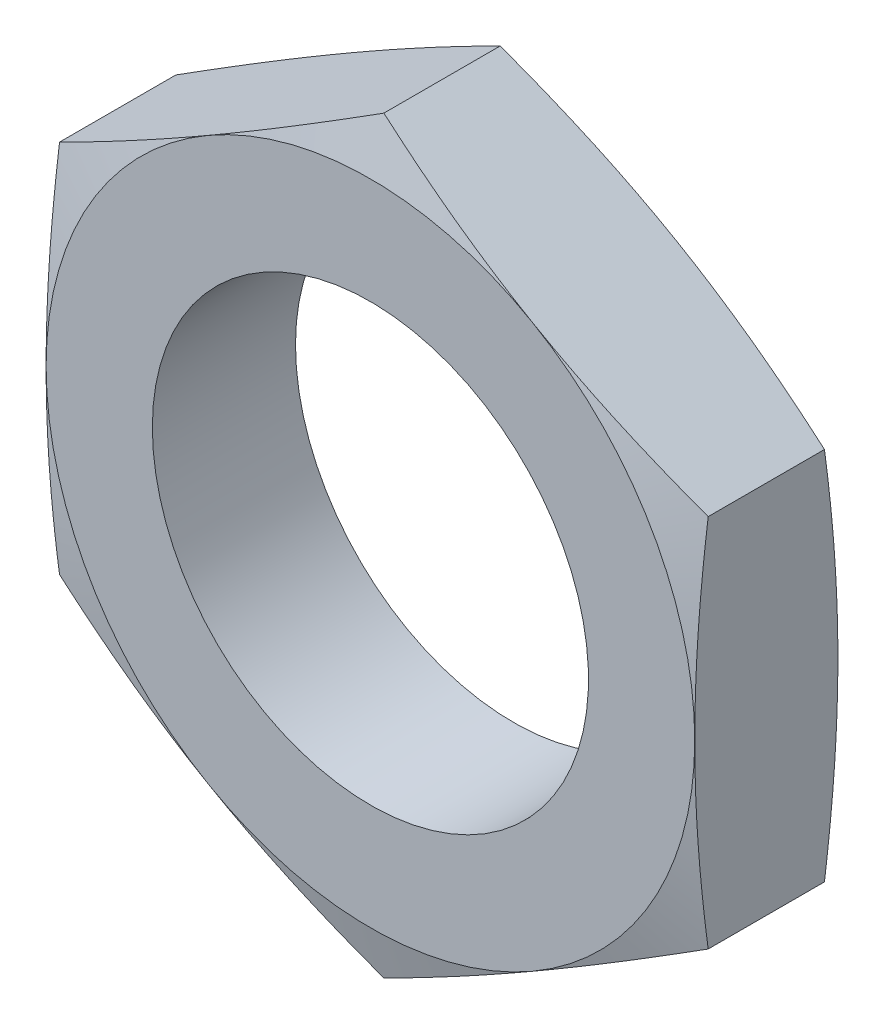
ISO-10303-21;
HEADER;
FILE_DESCRIPTION(('STEP AP214'),'2;1');
FILE_NAME('part.step','',(''),(''),'','','');
FILE_SCHEMA(('AUTOMOTIVE_DESIGN { 1 0 10303 214 1 1 1 1 }'));
ENDSEC;
DATA;
#1=APPLICATION_CONTEXT('core data for automotive mechanical design processes');
#2=APPLICATION_PROTOCOL_DEFINITION('international standard','automotive_design',2000,#1);
#3=PRODUCT_CONTEXT('',#1,'mechanical');
#4=PRODUCT('Part','Part','',(#3));
#5=PRODUCT_RELATED_PRODUCT_CATEGORY('part','',(#4));
#6=PRODUCT_DEFINITION_FORMATION('','',#4);
#7=PRODUCT_DEFINITION_CONTEXT('part definition',#1,'design');
#8=PRODUCT_DEFINITION('design','',#6,#7);
#9=PRODUCT_DEFINITION_SHAPE('','',#8);
#10=(LENGTH_UNIT() NAMED_UNIT(*) SI_UNIT(.MILLI.,.METRE.));
#11=(NAMED_UNIT(*) PLANE_ANGLE_UNIT() SI_UNIT($,.RADIAN.));
#12=(NAMED_UNIT(*) SI_UNIT($,.STERADIAN.) SOLID_ANGLE_UNIT());
#13=UNCERTAINTY_MEASURE_WITH_UNIT(LENGTH_MEASURE(1.E-05),#10,'distance_accuracy_value','');
#14=(GEOMETRIC_REPRESENTATION_CONTEXT(3) GLOBAL_UNCERTAINTY_ASSIGNED_CONTEXT((#13)) GLOBAL_UNIT_ASSIGNED_CONTEXT((#10,
#11,#12)) REPRESENTATION_CONTEXT('',''));
#15=CARTESIAN_POINT('',(0.,0.,0.));
#16=DIRECTION('',(0.,0.,1.));
#17=DIRECTION('',(1.,0.,0.));
#18=AXIS2_PLACEMENT_3D('',#15,#16,#17);
#19=CARTESIAN_POINT('',(14.4999999999999,8.37157890324973,6.4));
#20=DIRECTION('',(-0.499999999999995,-0.866025403784442,0.));
#21=DIRECTION('',(0.866025403784442,-0.499999999999995,0.));
#22=AXIS2_PLACEMENT_3D('',#19,#20,#21);
#23=PLANE('',#22);
#24=CARTESIAN_POINT('',(-0.000199999999999569,16.743273276553,0.601083263174753));
#25=CARTESIAN_POINT('',(0.601965186280981,16.395613044157,0.507890804699053));
#26=CARTESIAN_POINT('',(1.20522213258625,16.0473224838172,0.423287577643832));
#27=CARTESIAN_POINT('',(2.41386637390098,15.3495114057396,0.274647818411473));
#28=CARTESIAN_POINT('',(3.01925443351179,14.9999904465591,0.210619639168989));
#29=CARTESIAN_POINT('',(4.22849061008879,14.3018376144986,0.106867737742874));
#30=CARTESIAN_POINT('',(4.83233055103587,13.9532104620453,0.0670202927629115));
#31=CARTESIAN_POINT('',(6.04078044240142,13.2555115919633,0.0135889643184655));
#32=CARTESIAN_POINT('',(6.64539022120068,12.9064399734189,0.));
#33=CARTESIAN_POINT('',(7.8546097787992,12.20829673633,0.));
#34=CARTESIAN_POINT('',(8.45921955759846,11.8592251177856,0.0135889643184655));
#35=CARTESIAN_POINT('',(9.66766944896401,11.1615262477035,0.0670202927629114));
#36=CARTESIAN_POINT('',(10.2715093899111,10.8128990952503,0.106867737742873));
#37=CARTESIAN_POINT('',(11.4807455664881,10.1147462631897,0.210619639168988));
#38=CARTESIAN_POINT('',(12.0861336260989,9.76522530400923,0.274647818411473));
#39=CARTESIAN_POINT('',(13.2947778674136,9.06741422593169,0.423287577643832));
#40=CARTESIAN_POINT('',(13.8980348137189,8.71912366559184,0.507890804699053));
#41=CARTESIAN_POINT('',(14.5001999999999,8.37146343319589,0.601083263174753));
#42=B_SPLINE_CURVE_WITH_KNOTS('',3,(#24,#25,#26,#27,#28,#29,#30,#31,#32,#33,#34,#35,#36,#37,#38,
#39,#40,#41),.UNSPECIFIED.,.F.,.F.,(4,2,2,2,2,2,2,2,4),(0.,2.10472386863188,4.21030112410751,
6.30501212383057,8.39931776929981,10.493623414769,12.5883344144921,14.6939116699677,
16.7986355385996),.UNSPECIFIED.);
#43=CARTESIAN_POINT('',(0.,16.7431578064991,0.601052322747009));
#44=VERTEX_POINT('',#43);
#45=CARTESIAN_POINT('',(7.24999999999991,12.5573683548744,0.));
#46=VERTEX_POINT('',#45);
#47=EDGE_CURVE('E55',#44,#46,#42,.T.);
#48=ORIENTED_EDGE('',*,*,#47,.F.);
#49=DIRECTION('',(0.,0.,-1.));
#50=VECTOR('',#49,1.);
#51=CARTESIAN_POINT('',(0.,16.7431578064991,6.4));
#52=LINE('',#51,#50);
#53=CARTESIAN_POINT('',(0.,16.7431578064991,5.79894767725301));
#54=VERTEX_POINT('',#53);
#55=EDGE_CURVE('E172',#54,#44,#52,.T.);
#56=ORIENTED_EDGE('',*,*,#55,.F.);
#57=CARTESIAN_POINT('',(14.5001999999999,8.37146343319589,5.79891673682526));
#58=CARTESIAN_POINT('',(13.8980348137189,8.71912366559183,5.89210919530096));
#59=CARTESIAN_POINT('',(13.2947778674136,9.06741422593169,5.97671242235618));
#60=CARTESIAN_POINT('',(12.0861336260989,9.76522530400922,6.12535218158854));
#61=CARTESIAN_POINT('',(11.4807455664881,10.1147462631897,6.18938036083103));
#62=CARTESIAN_POINT('',(10.2715093899111,10.8128990952503,6.29313226225714));
#63=CARTESIAN_POINT('',(9.66766944896402,11.1615262477035,6.3329797072371));
#64=CARTESIAN_POINT('',(8.45921955759846,11.8592251177856,6.38641103568155));
#65=CARTESIAN_POINT('',(7.8546097787992,12.20829673633,6.4));
#66=CARTESIAN_POINT('',(6.64539022120068,12.9064399734189,6.4));
#67=CARTESIAN_POINT('',(6.04078044240142,13.2555115919633,6.38641103568155));
#68=CARTESIAN_POINT('',(4.83233055103587,13.9532104620453,6.3329797072371));
#69=CARTESIAN_POINT('',(4.22849061008879,14.3018376144986,6.29313226225714));
#70=CARTESIAN_POINT('',(3.01925443351179,14.9999904465591,6.18938036083103));
#71=CARTESIAN_POINT('',(2.41386637390098,15.3495114057396,6.12535218158854));
#72=CARTESIAN_POINT('',(1.20522213258625,16.0473224838172,5.97671242235618));
#73=CARTESIAN_POINT('',(0.601965186280984,16.395613044157,5.89210919530096));
#74=CARTESIAN_POINT('',(-0.000199999999997783,16.743273276553,5.79891673682526));
#75=B_SPLINE_CURVE_WITH_KNOTS('',3,(#57,#58,#59,#60,#61,#62,#63,#64,#65,#66,#67,#68,#69,#70,#71,
#72,#73,#74),.UNSPECIFIED.,.F.,.F.,(4,2,2,2,2,2,2,2,4),(0.,2.10472386863187,4.21030112410751,
6.30501212383057,8.39931776929981,10.493623414769,12.5883344144921,14.6939116699677,
16.7986355385996),.UNSPECIFIED.);
#76=CARTESIAN_POINT('',(7.24999999999994,12.5573683548744,6.4));
#77=VERTEX_POINT('',#76);
#78=EDGE_CURVE('E245',#77,#54,#75,.T.);
#79=ORIENTED_EDGE('',*,*,#78,.F.);
#80=CARTESIAN_POINT('',(14.4999999999999,8.37157890324973,5.79894767725301));
#81=VERTEX_POINT('',#80);
#82=EDGE_CURVE('E163',#81,#77,#75,.T.);
#83=ORIENTED_EDGE('',*,*,#82,.F.);
#84=DIRECTION('',(0.,0.,-1.));
#85=VECTOR('',#84,1.);
#86=CARTESIAN_POINT('',(14.4999999999999,8.37157890324973,6.4));
#87=LINE('',#86,#85);
#88=CARTESIAN_POINT('',(14.4999999999999,8.37157890324973,0.601052322747009));
#89=VERTEX_POINT('',#88);
#90=EDGE_CURVE('E158',#81,#89,#87,.T.);
#91=ORIENTED_EDGE('',*,*,#90,.T.);
#92=EDGE_CURVE('E150',#46,#89,#42,.T.);
#93=ORIENTED_EDGE('',*,*,#92,.F.);
#94=EDGE_LOOP('',(#48,#56,#79,#83,#91,#93));
#95=FACE_BOUND('',#94,.T.);
#96=ADVANCED_FACE('F39',(#95),#23,.F.);
#97=CARTESIAN_POINT('',(0.,16.7431578064991,6.4));
#98=DIRECTION('',(0.500000000000001,-0.866025403784438,0.));
#99=DIRECTION('',(0.866025403784438,0.500000000000001,0.));
#100=AXIS2_PLACEMENT_3D('',#97,#98,#99);
#101=PLANE('',#100);
#102=CARTESIAN_POINT('',(-14.5002,8.37146343319569,0.601083263174754));
#103=CARTESIAN_POINT('',(-13.898034813719,8.71912366559164,0.507890804699052));
#104=CARTESIAN_POINT('',(-13.2947778674137,9.0674142259315,0.423287577643828));
#105=CARTESIAN_POINT('',(-12.086133626099,9.76522530400906,0.274647818411465));
#106=CARTESIAN_POINT('',(-11.4807455664882,10.1147462631895,0.210619639168979));
#107=CARTESIAN_POINT('',(-10.2715093899112,10.8128990952501,0.106867737742861));
#108=CARTESIAN_POINT('',(-9.6676694489641,11.1615262477034,0.0670202927628979));
#109=CARTESIAN_POINT('',(-8.45921955759853,11.8592251177855,0.0135889643184504));
#110=CARTESIAN_POINT('',(-7.85460977879927,12.2082967363299,0.));
#111=CARTESIAN_POINT('',(-6.64539022120074,12.9064399734188,0.));
#112=CARTESIAN_POINT('',(-6.04078044240147,13.2555115919632,0.0135889643184496));
#113=CARTESIAN_POINT('',(-4.83233055103591,13.9532104620453,0.0670202927628971));
#114=CARTESIAN_POINT('',(-4.22849061008883,14.3018376144985,0.10686773774286));
#115=CARTESIAN_POINT('',(-3.01925443351182,14.9999904465591,0.210619639168978));
#116=CARTESIAN_POINT('',(-2.413866373901,15.3495114057396,0.274647818411464));
#117=CARTESIAN_POINT('',(-1.20522213258626,16.0473224838171,0.423287577643827));
#118=CARTESIAN_POINT('',(-0.601965186280988,16.395613044157,0.50789080469905));
#119=CARTESIAN_POINT('',(0.000199999999997846,16.743273276553,0.601083263174753));
#120=B_SPLINE_CURVE_WITH_KNOTS('',3,(#102,#103,#104,#105,#106,#107,#108,#109,#110,#111,#112,
#113,#114,#115,#116,#117,#118,#119),.UNSPECIFIED.,.F.,.F.,(4,2,2,2,2,2,2,2,4),(0.,
2.1047238686319,4.21030112410756,6.30501212383065,8.39931776929991,10.4936234147692,
12.5883344144923,14.6939116699679,16.7986355385998),.UNSPECIFIED.);
#121=CARTESIAN_POINT('',(-14.5,8.37157890324953,0.601052322747009));
#122=VERTEX_POINT('',#121);
#123=CARTESIAN_POINT('',(-7.25,12.5573683548743,0.));
#124=VERTEX_POINT('',#123);
#125=EDGE_CURVE('E62',#122,#124,#120,.T.);
#126=ORIENTED_EDGE('',*,*,#125,.F.);
#127=DIRECTION('',(0.,0.,-1.));
#128=VECTOR('',#127,1.);
#129=CARTESIAN_POINT('',(-14.5,8.37157890324953,6.4));
#130=LINE('',#129,#128);
#131=CARTESIAN_POINT('',(-14.5,8.37157890324953,5.79894767725301));
#132=VERTEX_POINT('',#131);
#133=EDGE_CURVE('E169',#132,#122,#130,.T.);
#134=ORIENTED_EDGE('',*,*,#133,.F.);
#135=CARTESIAN_POINT('',(0.000200000000000019,16.743273276553,5.79891673682526));
#136=CARTESIAN_POINT('',(-0.601965186280988,16.395613044157,5.89210919530096));
#137=CARTESIAN_POINT('',(-1.20522213258626,16.0473224838171,5.97671242235619));
#138=CARTESIAN_POINT('',(-2.413866373901,15.3495114057396,6.12535218158855));
#139=CARTESIAN_POINT('',(-3.01925443351181,14.9999904465591,6.18938036083104));
#140=CARTESIAN_POINT('',(-4.22849061008882,14.3018376144985,6.29313226225715));
#141=CARTESIAN_POINT('',(-4.8323305510359,13.9532104620453,6.33297970723712));
#142=CARTESIAN_POINT('',(-6.04078044240147,13.2555115919632,6.38641103568157));
#143=CARTESIAN_POINT('',(-6.64539022120073,12.9064399734188,6.40000000000002));
#144=CARTESIAN_POINT('',(-7.85460977879926,12.2082967363299,6.40000000000002));
#145=CARTESIAN_POINT('',(-8.45921955759853,11.8592251177855,6.38641103568157));
#146=CARTESIAN_POINT('',(-9.66766944896409,11.1615262477034,6.33297970723712));
#147=CARTESIAN_POINT('',(-10.2715093899112,10.8128990952501,6.29313226225715));
#148=CARTESIAN_POINT('',(-11.4807455664882,10.1147462631896,6.18938036083104));
#149=CARTESIAN_POINT('',(-12.086133626099,9.76522530400906,6.12535218158855));
#150=CARTESIAN_POINT('',(-13.2947778674137,9.06741422593151,5.97671242235619));
#151=CARTESIAN_POINT('',(-13.898034813719,8.71912366559164,5.89210919530096));
#152=CARTESIAN_POINT('',(-14.5002,8.37146343319569,5.79891673682526));
#153=B_SPLINE_CURVE_WITH_KNOTS('',3,(#135,#136,#137,#138,#139,#140,#141,#142,#143,#144,#145,
#146,#147,#148,#149,#150,#151,#152),.UNSPECIFIED.,.F.,.F.,(4,2,2,2,2,2,2,2,4),(0.,
2.1047238686319,4.21030112410756,6.30501212383065,8.39931776929991,10.4936234147692,
12.5883344144923,14.6939116699679,16.7986355385998),.UNSPECIFIED.);
#154=CARTESIAN_POINT('',(-7.25000000000003,12.5573683548744,6.4));
#155=VERTEX_POINT('',#154);
#156=EDGE_CURVE('E307',#155,#132,#153,.T.);
#157=ORIENTED_EDGE('',*,*,#156,.F.);
#158=EDGE_CURVE('E312',#54,#155,#153,.T.);
#159=ORIENTED_EDGE('',*,*,#158,.F.);
#160=ORIENTED_EDGE('',*,*,#55,.T.);
#161=EDGE_CURVE('E289',#124,#44,#120,.T.);
#162=ORIENTED_EDGE('',*,*,#161,.F.);
#163=EDGE_LOOP('',(#126,#134,#157,#159,#160,#162));
#164=FACE_BOUND('',#163,.T.);
#165=ADVANCED_FACE('F300',(#164),#101,.F.);
#166=CARTESIAN_POINT('',(-14.5,8.37157890324953,6.4));
#167=DIRECTION('',(1.,0.,0.));
#168=DIRECTION('',(0.,1.,0.));
#169=AXIS2_PLACEMENT_3D('',#166,#167,#168);
#170=PLANE('',#169);
#171=CARTESIAN_POINT('',(-14.4999999999999,-22.5533838523425,3.29909928297034));
#172=CARTESIAN_POINT('',(-14.4999999999999,-21.8906473450721,3.14976619157739));
#173=CARTESIAN_POINT('',(-14.4999999999999,-21.2275073577728,3.00219277184909));
#174=CARTESIAN_POINT('',(-14.4999999999999,-19.9002213160471,2.71151611267545));
#175=CARTESIAN_POINT('',(-14.4999999999999,-19.2360752218998,2.56841305481014));
#176=CARTESIAN_POINT('',(-14.4999999999999,-17.9060487916525,2.28751714049597));
#177=CARTESIAN_POINT('',(-14.4999999999999,-17.2401674455668,2.14972904988582));
#178=CARTESIAN_POINT('',(-14.4999999999999,-15.9070478073432,1.8808847308727));
#179=CARTESIAN_POINT('',(-14.4999999999999,-15.2398095259309,1.74982844947341));
#180=CARTESIAN_POINT('',(-14.4999999999999,-13.9093658701792,1.49712931737941));
#181=CARTESIAN_POINT('',(-14.4999999999999,-13.246173850133,1.37541649043587));
#182=CARTESIAN_POINT('',(-14.4999999999999,-11.9179880808604,1.14217211577601));
#183=CARTESIAN_POINT('',(-14.4999999999999,-11.2529943252842,1.03064060398852));
#184=CARTESIAN_POINT('',(-14.4999999999999,-9.92104491821884,0.820186286632011));
#185=CARTESIAN_POINT('',(-14.4999999999999,-9.25408940568837,0.721262609006342));
#186=CARTESIAN_POINT('',(-14.4999999999999,-7.91804500710918,0.538862656758016));
#187=CARTESIAN_POINT('',(-14.4999999999999,-7.24895611663721,0.455386414184594));
#188=CARTESIAN_POINT('',(-14.4999999999999,-5.90089094661505,0.306148209547718));
#189=CARTESIAN_POINT('',(-14.5,-5.22189023218801,0.240603750994031));
#190=CARTESIAN_POINT('',(-14.5,-3.86209627889257,0.131698869913685));
#191=CARTESIAN_POINT('',(-14.5,-3.18130308164204,0.0883379368165294));
#192=CARTESIAN_POINT('',(-14.5,-1.81893698540228,0.026322537716703));
#193=CARTESIAN_POINT('',(-14.5,-1.13736470461589,0.007654764937362));
#194=CARTESIAN_POINT('',(-14.5,0.22599986642956,-0.00381855993917961));
#195=CARTESIAN_POINT('',(-14.5,0.907792155944753,0.00337580142029072));
#196=CARTESIAN_POINT('',(-14.5,2.27345561351304,0.0432384093971026));
#197=CARTESIAN_POINT('',(-14.5,2.95732362711219,0.076012529488041));
#198=CARTESIAN_POINT('',(-14.5,4.32350709032153,0.16514396577199));
#199=CARTESIAN_POINT('',(-14.5,5.00582250338377,0.22150183146445));
#200=CARTESIAN_POINT('',(-14.5,6.36890296612819,0.354855065203368));
#201=CARTESIAN_POINT('',(-14.5,7.0496665250651,0.431865431235795));
#202=CARTESIAN_POINT('',(-14.5,8.40898334068276,0.603194115088003));
#203=CARTESIAN_POINT('',(-14.5,9.08753659823865,0.697512426054153));
#204=CARTESIAN_POINT('',(-14.5,10.5082029148058,0.910144402458125));
#205=CARTESIAN_POINT('',(-14.5,11.2500985848391,1.02989802404484));
#206=CARTESIAN_POINT('',(-14.5,12.7316030009676,1.28287772763323));
#207=CARTESIAN_POINT('',(-14.5,13.4712116388963,1.41610443710476));
#208=CARTESIAN_POINT('',(-14.5,14.9485553839596,1.69317251911506));
#209=CARTESIAN_POINT('',(-14.5,15.6862901538971,1.83701567897185));
#210=CARTESIAN_POINT('',(-14.5,17.1600637054127,2.13304524327469));
#211=CARTESIAN_POINT('',(-14.5,17.8961025140865,2.28523151345002));
#212=CARTESIAN_POINT('',(-14.5,19.3671205485884,2.59629033657925));
#213=CARTESIAN_POINT('',(-14.5,20.1020991187184,2.75516598015182));
#214=CARTESIAN_POINT('',(-14.5,21.5708920583984,3.07820746185538));
#215=CARTESIAN_POINT('',(-14.5,22.3047064245737,3.24237331529156));
#216=CARTESIAN_POINT('',(-14.5000000000001,23.7712903490355,3.57495273715999));
#217=CARTESIAN_POINT('',(-14.5000000000001,24.5040600075863,3.74336586425503));
#218=CARTESIAN_POINT('',(-14.5000000000001,25.968791830806,4.0836709567201));
#219=CARTESIAN_POINT('',(-14.5000000000001,26.700753993308,4.25556293140138));
#220=CARTESIAN_POINT('',(-14.5000000000001,28.8772331005918,4.77113914226115));
#221=CARTESIAN_POINT('',(-14.5000000000001,30.3207745569923,5.11894005755127));
#222=CARTESIAN_POINT('',(-14.5000000000001,33.2060186758247,5.82224000218139));
#223=CARTESIAN_POINT('',(-14.5000000000001,34.6477212823578,6.17773925990142));
#224=CARTESIAN_POINT('',(-14.5000000000001,37.527309622269,6.89369508384014));
#225=CARTESIAN_POINT('',(-14.5000000000001,38.9651976904989,7.25414226845832));
#226=CARTESIAN_POINT('',(-14.5000000000001,41.1212191073954,7.79789365354043));
#227=CARTESIAN_POINT('',(-14.5000000000001,41.8397426914284,7.97965369376281));
#228=CARTESIAN_POINT('',(-14.5000000000001,43.2765600782536,8.34407720514797));
#229=CARTESIAN_POINT('',(-14.5000000000001,43.9948538812467,8.52674067551917));
#230=CARTESIAN_POINT('',(-14.5000000000001,44.7130485963788,8.70979307349425));
#231=B_SPLINE_CURVE_WITH_KNOTS('',3,(#171,#172,#173,#174,#175,#176,#177,#178,#179,#180,#181,
#182,#183,#184,#185,#186,#187,#188,#189,#190,#191,#192,#193,#194,#195,#196,#197,#198,#199,#200,
#201,#202,#203,#204,#205,#206,#207,#208,#209,#210,#211,#212,#213,#214,#215,#216,#217,#218,#219,
#220,#221,#222,#223,#224,#225,#226,#227,#228,#229,#230),.UNSPECIFIED.,.F.,.F.,(4,2,2,2,2,2,2,2,
2,2,2,2,2,2,2,2,2,2,2,2,2,2,2,2,2,2,2,2,2,4),(0.,2.03806580729687,4.0762142907042,
6.1161497639079,8.15606917521026,10.1788106022025,12.2015591669681,14.224167746569,
16.2467805224867,18.2929364207682,20.3390452231162,22.3840509580699,24.4290498497585,
26.4825580783676,28.5361141562239,30.5911655978442,32.6462162257031,34.9005518752402,
37.1549925622925,39.4098136622118,41.6645984845791,43.9204367444627,46.1762815313294,
48.4318928698038,50.6875102462905,55.142022755376,59.5966675941455,64.0437924685854,
66.2672613556626,68.4907282948849),.UNSPECIFIED.);
#232=CARTESIAN_POINT('',(-14.4999999999999,-8.37157890324963,0.601052322747009));
#233=VERTEX_POINT('',#232);
#234=CARTESIAN_POINT('',(-14.5,0.,0.));
#235=VERTEX_POINT('',#234);
#236=EDGE_CURVE('E321',#233,#235,#231,.T.);
#237=ORIENTED_EDGE('',*,*,#236,.F.);
#238=DIRECTION('',(0.,0.,-1.));
#239=VECTOR('',#238,1.);
#240=CARTESIAN_POINT('',(-14.4999999999999,-8.37157890324963,6.4));
#241=LINE('',#240,#239);
#242=CARTESIAN_POINT('',(-14.4999999999999,-8.37157890324963,5.79894767725301));
#243=VERTEX_POINT('',#242);
#244=EDGE_CURVE('E160',#243,#233,#241,.T.);
#245=ORIENTED_EDGE('',*,*,#244,.F.);
#246=CARTESIAN_POINT('',(-14.4999999999999,-22.5533838523425,3.10090071702968));
#247=CARTESIAN_POINT('',(-14.4999999999999,-21.8906473450721,3.25023380842263));
#248=CARTESIAN_POINT('',(-14.4999999999999,-21.2275073577728,3.39780722815092));
#249=CARTESIAN_POINT('',(-14.4999999999999,-19.9002213160471,3.68848388732457));
#250=CARTESIAN_POINT('',(-14.4999999999999,-19.2360752218998,3.83158694518988));
#251=CARTESIAN_POINT('',(-14.4999999999999,-17.9060487916526,4.11248285950404));
#252=CARTESIAN_POINT('',(-14.4999999999999,-17.2401674455668,4.25027095011419));
#253=CARTESIAN_POINT('',(-14.4999999999999,-15.9070478073432,4.51911526912732));
#254=CARTESIAN_POINT('',(-14.4999999999999,-15.2398095259309,4.65017155052661));
#255=CARTESIAN_POINT('',(-14.4999999999999,-13.9093658701792,4.9028706826206));
#256=CARTESIAN_POINT('',(-14.4999999999999,-13.246173850133,5.02458350956415));
#257=CARTESIAN_POINT('',(-14.4999999999999,-11.9179880808604,5.25782788422401));
#258=CARTESIAN_POINT('',(-14.4999999999999,-11.2529943252842,5.36935939601149));
#259=CARTESIAN_POINT('',(-14.4999999999999,-9.92104491821884,5.579813713368));
#260=CARTESIAN_POINT('',(-14.4999999999999,-9.25408940568837,5.67873739099367));
#261=CARTESIAN_POINT('',(-14.4999999999999,-7.91804500710918,5.861137343242));
#262=CARTESIAN_POINT('',(-14.4999999999999,-7.24895611663721,5.94461358581542));
#263=CARTESIAN_POINT('',(-14.4999999999999,-5.90089094661506,6.0938517904523));
#264=CARTESIAN_POINT('',(-14.5,-5.22189023218802,6.15939624900598));
#265=CARTESIAN_POINT('',(-14.5,-3.86209627889257,6.26830113008633));
#266=CARTESIAN_POINT('',(-14.5,-3.18130308164204,6.31166206318349));
#267=CARTESIAN_POINT('',(-14.5,-1.81893698540228,6.37367746228331));
#268=CARTESIAN_POINT('',(-14.5,-1.13736470461589,6.39234523506265));
#269=CARTESIAN_POINT('',(-14.5,0.225999866429558,6.40381855993919));
#270=CARTESIAN_POINT('',(-14.5,0.907792155944751,6.39662419857972));
#271=CARTESIAN_POINT('',(-14.5,2.27345561351304,6.35676159060291));
#272=CARTESIAN_POINT('',(-14.5,2.95732362711219,6.32398747051197));
#273=CARTESIAN_POINT('',(-14.5,4.32350709032153,6.23485603422803));
#274=CARTESIAN_POINT('',(-14.5,5.00582250338377,6.17849816853557));
#275=CARTESIAN_POINT('',(-14.5,6.36890296612819,6.04514493479665));
#276=CARTESIAN_POINT('',(-14.5,7.04966652506509,5.96813456876422));
#277=CARTESIAN_POINT('',(-14.5,8.40898334068275,5.79680588491201));
#278=CARTESIAN_POINT('',(-14.5,9.08753659823864,5.70248757394586));
#279=CARTESIAN_POINT('',(-14.5,10.5082029148058,5.48985559754189));
#280=CARTESIAN_POINT('',(-14.5,11.2500985848391,5.37010197595517));
#281=CARTESIAN_POINT('',(-14.5,12.7316030009676,5.11712227236678));
#282=CARTESIAN_POINT('',(-14.5,13.4712116388963,4.98389556289525));
#283=CARTESIAN_POINT('',(-14.5,14.9485553839596,4.70682748088496));
#284=CARTESIAN_POINT('',(-14.5,15.6862901538971,4.56298432102816));
#285=CARTESIAN_POINT('',(-14.5,17.1600637054127,4.26695475672532));
#286=CARTESIAN_POINT('',(-14.5,17.8961025140865,4.11476848654999));
#287=CARTESIAN_POINT('',(-14.5,19.3671205485884,3.80370966342077));
#288=CARTESIAN_POINT('',(-14.5,20.1020991187184,3.6448340198482));
#289=CARTESIAN_POINT('',(-14.5,21.5708920583984,3.32179253814463));
#290=CARTESIAN_POINT('',(-14.5,22.3047064245737,3.15762668470846));
#291=CARTESIAN_POINT('',(-14.5000000000001,23.7712903490355,2.82504726284003));
#292=CARTESIAN_POINT('',(-14.5000000000001,24.5040600075863,2.65663413574499));
#293=CARTESIAN_POINT('',(-14.5000000000001,25.9687918308059,2.31632904327992));
#294=CARTESIAN_POINT('',(-14.5000000000001,26.700753993308,2.14443706859864));
#295=CARTESIAN_POINT('',(-14.5000000000001,28.8772331005918,1.62886085773887));
#296=CARTESIAN_POINT('',(-14.5000000000001,30.3207745569923,1.28105994244874));
#297=CARTESIAN_POINT('',(-14.5000000000001,33.2060186758247,0.577759997818624));
#298=CARTESIAN_POINT('',(-14.5000000000001,34.6477212823578,0.222260740098592));
#299=CARTESIAN_POINT('',(-14.5000000000001,37.527309622269,-0.493695083840129));
#300=CARTESIAN_POINT('',(-14.5000000000001,38.9651976904989,-0.854142268458305));
#301=CARTESIAN_POINT('',(-14.5000000000001,41.1212191073954,-1.39789365354042));
#302=CARTESIAN_POINT('',(-14.5000000000001,41.8397426914284,-1.5796536937628));
#303=CARTESIAN_POINT('',(-14.5000000000001,43.2765600782536,-1.94407720514796));
#304=CARTESIAN_POINT('',(-14.5000000000001,43.9948538812467,-2.12674067551916));
#305=CARTESIAN_POINT('',(-14.5000000000001,44.7130485963788,-2.30979307349423));
#306=B_SPLINE_CURVE_WITH_KNOTS('',3,(#246,#247,#248,#249,#250,#251,#252,#253,#254,#255,#256,
#257,#258,#259,#260,#261,#262,#263,#264,#265,#266,#267,#268,#269,#270,#271,#272,#273,#274,#275,
#276,#277,#278,#279,#280,#281,#282,#283,#284,#285,#286,#287,#288,#289,#290,#291,#292,#293,#294,
#295,#296,#297,#298,#299,#300,#301,#302,#303,#304,#305),.UNSPECIFIED.,.F.,.F.,(4,2,2,2,2,2,2,2,
2,2,2,2,2,2,2,2,2,2,2,2,2,2,2,2,2,2,2,2,2,4),(0.,2.03806580729687,4.0762142907042,
6.11614976390789,8.15606917521026,10.1788106022025,12.2015591669681,14.224167746569,
16.2467805224867,18.2929364207682,20.3390452231162,22.3840509580699,24.4290498497585,
26.4825580783676,28.5361141562239,30.5911655978442,32.6462162257031,34.9005518752402,
37.1549925622925,39.4098136622118,41.6645984845791,43.9204367444627,46.1762815313294,
48.4318928698038,50.6875102462905,55.142022755376,59.5966675941455,64.0437924685854,
66.2672613556626,68.4907282948849),.UNSPECIFIED.);
#307=CARTESIAN_POINT('',(-14.5,0.,6.4));
#308=VERTEX_POINT('',#307);
#309=EDGE_CURVE('E208',#308,#243,#306,.F.);
#310=ORIENTED_EDGE('',*,*,#309,.F.);
#311=EDGE_CURVE('E313',#132,#308,#306,.F.);
#312=ORIENTED_EDGE('',*,*,#311,.F.);
#313=ORIENTED_EDGE('',*,*,#133,.T.);
#314=EDGE_CURVE('E295',#235,#122,#231,.T.);
#315=ORIENTED_EDGE('',*,*,#314,.F.);
#316=EDGE_LOOP('',(#237,#245,#310,#312,#313,#315));
#317=FACE_BOUND('',#316,.T.);
#318=ADVANCED_FACE('F303',(#317),#170,.F.);
#319=CARTESIAN_POINT('',(-14.4999999999999,-8.37157890324963,6.4));
#320=DIRECTION('',(0.499999999999995,0.866025403784442,0.));
#321=DIRECTION('',(-0.866025403784442,0.499999999999995,0.));
#322=AXIS2_PLACEMENT_3D('',#319,#320,#321);
#323=PLANE('',#322);
#324=CARTESIAN_POINT('',(0.000200000000116917,-16.743273276553,0.601083263174753));
#325=CARTESIAN_POINT('',(-0.601965186280873,-16.395613044157,0.507890804699052));
#326=CARTESIAN_POINT('',(-1.20522213258615,-16.0473224838172,0.423287577643828));
#327=CARTESIAN_POINT('',(-2.41386637390089,-15.3495114057396,0.274647818411465));
#328=CARTESIAN_POINT('',(-3.01925443351171,-14.9999904465591,0.210619639168979));
#329=CARTESIAN_POINT('',(-4.22849061008872,-14.3018376144986,0.106867737742861));
#330=CARTESIAN_POINT('',(-4.83233055103581,-13.9532104620453,0.0670202927628975));
#331=CARTESIAN_POINT('',(-6.04078044240138,-13.2555115919632,0.0135889643184502));
#332=CARTESIAN_POINT('',(-6.64539022120064,-12.9064399734188,0.));
#333=CARTESIAN_POINT('',(-7.85460977879918,-12.2082967363299,0.));
#334=CARTESIAN_POINT('',(-8.45921955759844,-11.8592251177855,0.01358896431845));
#335=CARTESIAN_POINT('',(-9.66766944896401,-11.1615262477034,0.0670202927628971));
#336=CARTESIAN_POINT('',(-10.2715093899111,-10.8128990952502,0.10686773774286));
#337=CARTESIAN_POINT('',(-11.4807455664881,-10.1147462631896,0.210619639168978));
#338=CARTESIAN_POINT('',(-12.0861336260989,-9.76522530400914,0.274647818411465));
#339=CARTESIAN_POINT('',(-13.2947778674137,-9.0674142259316,0.423287577643828));
#340=CARTESIAN_POINT('',(-13.8980348137189,-8.71912366559174,0.507890804699051));
#341=CARTESIAN_POINT('',(-14.5001999999999,-8.37146343319579,0.601083263174753));
#342=B_SPLINE_CURVE_WITH_KNOTS('',3,(#324,#325,#326,#327,#328,#329,#330,#331,#332,#333,#334,
#335,#336,#337,#338,#339,#340,#341),.UNSPECIFIED.,.F.,.F.,(4,2,2,2,2,2,2,2,4),(0.,
2.1047238686319,4.21030112410756,6.30501212383065,8.39931776929991,10.4936234147692,
12.5883344144923,14.6939116699679,16.7986355385998),.UNSPECIFIED.);
#343=CARTESIAN_POINT('',(1.16902345028492E-13,-16.7431578064991,0.601052322747009));
#344=VERTEX_POINT('',#343);
#345=CARTESIAN_POINT('',(-7.24999999999991,-12.5573683548744,0.));
#346=VERTEX_POINT('',#345);
#347=EDGE_CURVE('E283',#344,#346,#342,.T.);
#348=ORIENTED_EDGE('',*,*,#347,.F.);
#349=DIRECTION('',(0.,0.,-1.));
#350=VECTOR('',#349,1.);
#351=CARTESIAN_POINT('',(1.16916846069395E-13,-16.7431578064991,6.4));
#352=LINE('',#351,#350);
#353=CARTESIAN_POINT('',(1.16915574581567E-13,-16.7431578064991,5.79894767725301));
#354=VERTEX_POINT('',#353);
#355=EDGE_CURVE('E157',#354,#344,#352,.T.);
#356=ORIENTED_EDGE('',*,*,#355,.F.);
#357=CARTESIAN_POINT('',(-14.5001999999999,-8.37146343319579,5.79891673682526));
#358=CARTESIAN_POINT('',(-13.898034813719,-8.71912366559174,5.89210919530096));
#359=CARTESIAN_POINT('',(-13.2947778674137,-9.06741422593159,5.97671242235619));
#360=CARTESIAN_POINT('',(-12.0861336260989,-9.76522530400914,6.12535218158855));
#361=CARTESIAN_POINT('',(-11.4807455664881,-10.1147462631896,6.18938036083104));
#362=CARTESIAN_POINT('',(-10.2715093899111,-10.8128990952502,6.29313226225715));
#363=CARTESIAN_POINT('',(-9.66766944896401,-11.1615262477034,6.33297970723712));
#364=CARTESIAN_POINT('',(-8.45921955759844,-11.8592251177855,6.38641103568157));
#365=CARTESIAN_POINT('',(-7.85460977879918,-12.2082967363299,6.40000000000002));
#366=CARTESIAN_POINT('',(-6.64539022120065,-12.9064399734188,6.40000000000002));
#367=CARTESIAN_POINT('',(-6.04078044240138,-13.2555115919632,6.38641103568157));
#368=CARTESIAN_POINT('',(-4.83233055103581,-13.9532104620453,6.33297970723712));
#369=CARTESIAN_POINT('',(-4.22849061008873,-14.3018376144986,6.29313226225715));
#370=CARTESIAN_POINT('',(-3.01925443351171,-14.9999904465591,6.18938036083104));
#371=CARTESIAN_POINT('',(-2.41386637390089,-15.3495114057396,6.12535218158855));
#372=CARTESIAN_POINT('',(-1.20522213258615,-16.0473224838172,5.97671242235619));
#373=CARTESIAN_POINT('',(-0.601965186280874,-16.395613044157,5.89210919530096));
#374=CARTESIAN_POINT('',(0.000200000000115832,-16.743273276553,5.79891673682526));
#375=B_SPLINE_CURVE_WITH_KNOTS('',3,(#357,#358,#359,#360,#361,#362,#363,#364,#365,#366,#367,
#368,#369,#370,#371,#372,#373,#374),.UNSPECIFIED.,.F.,.F.,(4,2,2,2,2,2,2,2,4),(0.,
2.1047238686319,4.21030112410756,6.30501212383065,8.39931776929991,10.4936234147692,
12.5883344144923,14.6939116699679,16.7986355385998),.UNSPECIFIED.);
#376=CARTESIAN_POINT('',(-7.24999999999994,-12.5573683548744,6.4));
#377=VERTEX_POINT('',#376);
#378=EDGE_CURVE('E199',#377,#354,#375,.T.);
#379=ORIENTED_EDGE('',*,*,#378,.F.);
#380=EDGE_CURVE('E202',#243,#377,#375,.T.);
#381=ORIENTED_EDGE('',*,*,#380,.F.);
#382=ORIENTED_EDGE('',*,*,#244,.T.);
#383=EDGE_CURVE('E290',#346,#233,#342,.T.);
#384=ORIENTED_EDGE('',*,*,#383,.F.);
#385=EDGE_LOOP('',(#348,#356,#379,#381,#382,#384));
#386=FACE_BOUND('',#385,.T.);
#387=ADVANCED_FACE('F201',(#386),#323,.F.);
#388=CARTESIAN_POINT('',(1.16916846069395E-13,-16.7431578064991,6.4));
#389=DIRECTION('',(-0.500000000000007,0.866025403784435,0.));
#390=DIRECTION('',(-0.866025403784435,-0.500000000000007,0.));
#391=AXIS2_PLACEMENT_3D('',#388,#389,#390);
#392=PLANE('',#391);
#393=CARTESIAN_POINT('',(14.5002000000001,-8.37146343319559,0.601083263174753));
#394=CARTESIAN_POINT('',(13.8980348137191,-8.71912366559155,0.507890804699051));
#395=CARTESIAN_POINT('',(13.2947778674138,-9.06741422593141,0.423287577643828));
#396=CARTESIAN_POINT('',(12.0861336260991,-9.76522530400898,0.274647818411465));
#397=CARTESIAN_POINT('',(11.4807455664883,-10.1147462631895,0.210619639168978));
#398=CARTESIAN_POINT('',(10.2715093899112,-10.8128990952501,0.10686773774286));
#399=CARTESIAN_POINT('',(9.66766944896417,-11.1615262477033,0.0670202927628974));
#400=CARTESIAN_POINT('',(8.45921955759861,-11.8592251177854,0.0135889643184503));
#401=CARTESIAN_POINT('',(7.85460977879935,-12.2082967363298,0.));
#402=CARTESIAN_POINT('',(6.64539022120082,-12.9064399734187,0.));
#403=CARTESIAN_POINT('',(6.04078044240156,-13.2555115919632,0.0135889643184497));
#404=CARTESIAN_POINT('',(4.832330551036,-13.9532104620453,0.0670202927628971));
#405=CARTESIAN_POINT('',(4.22849061008892,-14.3018376144985,0.10686773774286));
#406=CARTESIAN_POINT('',(3.01925443351192,-14.9999904465591,0.210619639168979));
#407=CARTESIAN_POINT('',(2.4138663739011,-15.3495114057396,0.274647818411465));
#408=CARTESIAN_POINT('',(1.20522213258637,-16.0473224838171,0.423287577643827));
#409=CARTESIAN_POINT('',(0.601965186281101,-16.395613044157,0.507890804699051));
#410=CARTESIAN_POINT('',(-0.000199999999881897,-16.743273276553,0.601083263174753));
#411=B_SPLINE_CURVE_WITH_KNOTS('',3,(#393,#394,#395,#396,#397,#398,#399,#400,#401,#402,#403,
#404,#405,#406,#407,#408,#409,#410),.UNSPECIFIED.,.F.,.F.,(4,2,2,2,2,2,2,2,4),(0.,
2.1047238686319,4.21030112410756,6.30501212383065,8.39931776929991,10.4936234147692,
12.5883344144923,14.6939116699679,16.7986355385998),.UNSPECIFIED.);
#412=CARTESIAN_POINT('',(14.5000000000001,-8.37157890324943,0.601052322747008));
#413=VERTEX_POINT('',#412);
#414=CARTESIAN_POINT('',(7.25000000000009,-12.5573683548743,0.));
#415=VERTEX_POINT('',#414);
#416=EDGE_CURVE('E133',#413,#415,#411,.T.);
#417=ORIENTED_EDGE('',*,*,#416,.F.);
#418=DIRECTION('',(0.,0.,-1.));
#419=VECTOR('',#418,1.);
#420=CARTESIAN_POINT('',(14.5000000000001,-8.37157890324943,6.4));
#421=LINE('',#420,#419);
#422=CARTESIAN_POINT('',(14.5000000000001,-8.37157890324943,5.79894767725301));
#423=VERTEX_POINT('',#422);
#424=EDGE_CURVE('E147',#423,#413,#421,.T.);
#425=ORIENTED_EDGE('',*,*,#424,.F.);
#426=CARTESIAN_POINT('',(-0.000199999999883101,-16.743273276553,5.79891673682526));
#427=CARTESIAN_POINT('',(0.601965186281101,-16.395613044157,5.89210919530096));
#428=CARTESIAN_POINT('',(1.20522213258637,-16.0473224838171,5.97671242235619));
#429=CARTESIAN_POINT('',(2.4138663739011,-15.3495114057396,6.12535218158855));
#430=CARTESIAN_POINT('',(3.01925443351192,-14.9999904465591,6.18938036083104));
#431=CARTESIAN_POINT('',(4.22849061008892,-14.3018376144985,6.29313226225715));
#432=CARTESIAN_POINT('',(4.832330551036,-13.9532104620453,6.33297970723712));
#433=CARTESIAN_POINT('',(6.04078044240156,-13.2555115919632,6.38641103568157));
#434=CARTESIAN_POINT('',(6.64539022120082,-12.9064399734187,6.40000000000002));
#435=CARTESIAN_POINT('',(7.85460977879935,-12.2082967363298,6.40000000000002));
#436=CARTESIAN_POINT('',(8.45921955759861,-11.8592251177854,6.38641103568157));
#437=CARTESIAN_POINT('',(9.66766944896417,-11.1615262477033,6.33297970723712));
#438=CARTESIAN_POINT('',(10.2715093899112,-10.8128990952501,6.29313226225715));
#439=CARTESIAN_POINT('',(11.4807455664883,-10.1147462631895,6.18938036083104));
#440=CARTESIAN_POINT('',(12.0861336260991,-9.76522530400898,6.12535218158855));
#441=CARTESIAN_POINT('',(13.2947778674138,-9.06741422593141,5.97671242235619));
#442=CARTESIAN_POINT('',(13.8980348137191,-8.71912366559155,5.89210919530096));
#443=CARTESIAN_POINT('',(14.5002000000001,-8.37146343319559,5.79891673682526));
#444=B_SPLINE_CURVE_WITH_KNOTS('',3,(#426,#427,#428,#429,#430,#431,#432,#433,#434,#435,#436,
#437,#438,#439,#440,#441,#442,#443),.UNSPECIFIED.,.F.,.F.,(4,2,2,2,2,2,2,2,4),(0.,
2.1047238686319,4.21030112410756,6.30501212383065,8.39931776929991,10.4936234147692,
12.5883344144923,14.6939116699679,16.7986355385998),.UNSPECIFIED.);
#445=CARTESIAN_POINT('',(7.25000000000011,-12.5573683548743,6.4));
#446=VERTEX_POINT('',#445);
#447=EDGE_CURVE('E209',#446,#423,#444,.T.);
#448=ORIENTED_EDGE('',*,*,#447,.F.);
#449=EDGE_CURVE('E206',#354,#446,#444,.T.);
#450=ORIENTED_EDGE('',*,*,#449,.F.);
#451=ORIENTED_EDGE('',*,*,#355,.T.);
#452=EDGE_CURVE('E149',#415,#344,#411,.T.);
#453=ORIENTED_EDGE('',*,*,#452,.F.);
#454=EDGE_LOOP('',(#417,#425,#448,#450,#451,#453));
#455=FACE_BOUND('',#454,.T.);
#456=ADVANCED_FACE('F145',(#455),#392,.F.);
#457=CARTESIAN_POINT('',(14.5000000000001,-8.37157890324943,6.4));
#458=DIRECTION('',(-1.,0.,0.));
#459=DIRECTION('',(0.,-1.,0.));
#460=AXIS2_PLACEMENT_3D('',#457,#458,#459);
#461=PLANE('',#460);
#462=CARTESIAN_POINT('',(14.5000000000002,-22.5533838428348,3.29909928082749));
#463=CARTESIAN_POINT('',(14.5000000000002,-21.8906473359493,3.14976618953965));
#464=CARTESIAN_POINT('',(14.5000000000002,-21.2275073490351,3.00219276991609));
#465=CARTESIAN_POINT('',(14.5000000000002,-19.9002213080799,2.71151611095041));
#466=CARTESIAN_POINT('',(14.5000000000002,-19.2360752143181,2.56841305318833));
#467=CARTESIAN_POINT('',(14.5000000000002,-17.9060487848436,2.2875171390786));
#468=CARTESIAN_POINT('',(14.5000000000001,-17.2401674391452,2.14972904856964));
#469=CARTESIAN_POINT('',(14.5000000000001,-15.9070478016972,1.88088472975536));
#470=CARTESIAN_POINT('',(14.5000000000001,-15.2398095206731,1.74982844845371));
#471=CARTESIAN_POINT('',(14.5000000000001,-13.9093658656887,1.49712931654747));
#472=CARTESIAN_POINT('',(14.5000000000001,-13.2461738460216,1.37541648969416));
#473=CARTESIAN_POINT('',(14.5000000000001,-11.9179880775087,1.14217211520718));
#474=CARTESIAN_POINT('',(14.5000000000001,-11.2529943223132,1.03064060350233));
#475=CARTESIAN_POINT('',(14.5000000000001,-9.92104491601112,0.820186286299995));
#476=CARTESIAN_POINT('',(14.5000000000001,-9.25408940386324,0.721262608745863));
#477=CARTESIAN_POINT('',(14.5000000000001,-7.91804500605168,0.538862656625));
#478=CARTESIAN_POINT('',(14.5,-7.24895611596475,0.455386414107503));
#479=CARTESIAN_POINT('',(14.5,-5.90089094675624,0.306148209566068));
#480=CARTESIAN_POINT('',(14.5,-5.22189023275794,0.240603751050625));
#481=CARTESIAN_POINT('',(14.5,-3.862096280322,0.13169887001726));
#482=CARTESIAN_POINT('',(14.5,-3.18130308350222,0.0883379369288445));
#483=CARTESIAN_POINT('',(14.5,-1.81893698812387,0.0263225378130073));
#484=CARTESIAN_POINT('',(14.5,-1.13736470776812,0.00765476500895059));
#485=CARTESIAN_POINT('',(14.5,0.225999862417472,-0.00381855995046732));
#486=CARTESIAN_POINT('',(14.5,0.907792151503457,0.00337580135084194));
#487=CARTESIAN_POINT('',(14.4999999999999,2.27345560821294,0.043238409181913));
#488=CARTESIAN_POINT('',(14.4999999999999,2.9573236213825,0.0760125291850835));
#489=CARTESIAN_POINT('',(14.4999999999999,4.3235070837366,0.165143965271426));
#490=CARTESIAN_POINT('',(14.4999999999999,5.00582249637319,0.221501830854045));
#491=CARTESIAN_POINT('',(14.4999999999999,6.36890295826877,0.354855064358834));
#492=CARTESIAN_POINT('',(14.4999999999999,7.04966651678248,0.431865430266931));
#493=CARTESIAN_POINT('',(14.4999999999999,8.40898333155672,0.60319411386258));
#494=CARTESIAN_POINT('',(14.4999999999999,9.08753658869237,0.697512424696501));
#495=CARTESIAN_POINT('',(14.4999999999999,10.5082029048513,0.910144400890048));
#496=CARTESIAN_POINT('',(14.4999999999998,11.2500985748951,1.02989802240902));
#497=CARTESIAN_POINT('',(14.4999999999998,12.7316029910433,1.2828777258763));
#498=CARTESIAN_POINT('',(14.4999999999998,13.4712116289812,1.41610443529448));
#499=CARTESIAN_POINT('',(14.4999999999998,14.9485553740619,1.69317251720948));
#500=CARTESIAN_POINT('',(14.4999999999998,15.6862901440075,1.83701567702436));
#501=CARTESIAN_POINT('',(14.4999999999998,17.1600636955379,2.13304524125215));
#502=CARTESIAN_POINT('',(14.4999999999998,17.8961025042184,2.28523151139435));
#503=CARTESIAN_POINT('',(14.4999999999998,19.3671205387351,2.59629033446459));
#504=CARTESIAN_POINT('',(14.4999999999998,20.1020991088732,2.75516597801133));
#505=CARTESIAN_POINT('',(14.4999999999997,21.5708920485682,3.07820745966844));
#506=CARTESIAN_POINT('',(14.4999999999997,22.3047064147505,3.242373313084));
#507=CARTESIAN_POINT('',(14.4999999999997,23.7712903392255,3.5749527349152));
#508=CARTESIAN_POINT('',(14.4999999999997,24.5040599977823,3.74336586199361));
#509=CARTESIAN_POINT('',(14.4999999999997,25.9687918210135,4.08367095442857));
#510=CARTESIAN_POINT('',(14.4999999999997,26.7007539835209,4.25556292909636));
#511=CARTESIAN_POINT('',(14.4999999999997,28.8772330908362,4.7711391399234));
#512=CARTESIAN_POINT('',(14.4999999999997,30.3207745472619,5.11894005519795));
#513=CARTESIAN_POINT('',(14.4999999999996,33.2060186661435,5.82223999980301));
#514=CARTESIAN_POINT('',(14.4999999999996,34.6477212727005,6.17773925751357));
#515=CARTESIAN_POINT('',(14.4999999999996,37.5273096126502,6.89369508143527));
#516=CARTESIAN_POINT('',(14.4999999999996,38.9651976808945,7.25414226604587));
#517=CARTESIAN_POINT('',(14.4999999999995,41.1212190978122,7.7978936511186));
#518=CARTESIAN_POINT('',(14.4999999999995,41.8397426818521,7.97965369133818));
#519=CARTESIAN_POINT('',(14.4999999999995,43.2765600686911,8.3440772027183));
#520=CARTESIAN_POINT('',(14.4999999999995,43.994853871691,8.52674067308726));
#521=CARTESIAN_POINT('',(14.4999999999995,44.7130485868298,8.70979307106034));
#522=B_SPLINE_CURVE_WITH_KNOTS('',3,(#462,#463,#464,#465,#466,#467,#468,#469,#470,#471,#472,
#473,#474,#475,#476,#477,#478,#479,#480,#481,#482,#483,#484,#485,#486,#487,#488,#489,#490,#491,
#492,#493,#494,#495,#496,#497,#498,#499,#500,#501,#502,#503,#504,#505,#506,#507,#508,#509,#510,
#511,#512,#513,#514,#515,#516,#517,#518,#519,#520,#521),.UNSPECIFIED.,.F.,.F.,(4,2,2,2,2,2,2,2,
2,2,2,2,2,2,2,2,2,2,2,2,2,2,2,2,2,2,2,2,2,4),(0.,2.03806580610115,4.07621428831268,
6.11614976031703,8.15606917042005,10.1788105962451,12.2015591598434,14.2241677382777,
16.2467805130287,18.2929364100194,20.339045211077,22.3840509447423,24.4290498351424,
26.4825580624522,28.5361141390092,30.5911655793261,32.6462162058818,34.9005518554173,
37.1549925424682,39.4098136423872,41.6645984647541,43.9204367246448,46.1762815115186,
48.4318928499996,50.6875102264928,55.1420227356409,59.5966675744734,64.0437924489498,
66.2672613360452,68.4907282752856),.UNSPECIFIED.);
#523=CARTESIAN_POINT('',(14.5,1.51733774472453E-13,0.));
#524=VERTEX_POINT('',#523);
#525=EDGE_CURVE('E139',#89,#524,#522,.F.);
#526=ORIENTED_EDGE('',*,*,#525,.F.);
#527=ORIENTED_EDGE('',*,*,#90,.F.);
#528=CARTESIAN_POINT('',(14.5000000000002,-22.5533838428348,3.10090071917253));
#529=CARTESIAN_POINT('',(14.5000000000002,-21.8906473359493,3.25023381046037));
#530=CARTESIAN_POINT('',(14.5000000000002,-21.2275073490351,3.39780723008393));
#531=CARTESIAN_POINT('',(14.5000000000002,-19.9002213080799,3.6884838890496));
#532=CARTESIAN_POINT('',(14.5000000000002,-19.2360752143181,3.83158694681169));
#533=CARTESIAN_POINT('',(14.5000000000002,-17.9060487848436,4.11248286092142));
#534=CARTESIAN_POINT('',(14.5000000000001,-17.2401674391452,4.25027095143038));
#535=CARTESIAN_POINT('',(14.5000000000001,-15.9070478016972,4.51911527024466));
#536=CARTESIAN_POINT('',(14.5000000000001,-15.2398095206731,4.6501715515463));
#537=CARTESIAN_POINT('',(14.5000000000001,-13.9093658656887,4.90287068345255));
#538=CARTESIAN_POINT('',(14.5000000000001,-13.2461738460216,5.02458351030586));
#539=CARTESIAN_POINT('',(14.5000000000001,-11.9179880775087,5.25782788479284));
#540=CARTESIAN_POINT('',(14.5000000000001,-11.2529943223132,5.36935939649768));
#541=CARTESIAN_POINT('',(14.5000000000001,-9.92104491601112,5.57981371370002));
#542=CARTESIAN_POINT('',(14.5000000000001,-9.25408940386324,5.67873739125415));
#543=CARTESIAN_POINT('',(14.5000000000001,-7.91804500605168,5.86113734337502));
#544=CARTESIAN_POINT('',(14.5,-7.24895611596475,5.94461358589251));
#545=CARTESIAN_POINT('',(14.5,-5.90089094675624,6.09385179043395));
#546=CARTESIAN_POINT('',(14.5,-5.22189023275794,6.15939624894939));
#547=CARTESIAN_POINT('',(14.5,-3.862096280322,6.26830112998276));
#548=CARTESIAN_POINT('',(14.5,-3.18130308350222,6.31166206307117));
#549=CARTESIAN_POINT('',(14.5,-1.81893698812387,6.37367746218701));
#550=CARTESIAN_POINT('',(14.5,-1.13736470776812,6.39234523499106));
#551=CARTESIAN_POINT('',(14.5,0.225999862417472,6.40381855995048));
#552=CARTESIAN_POINT('',(14.5,0.907792151503457,6.39662419864917));
#553=CARTESIAN_POINT('',(14.4999999999999,2.27345560821294,6.3567615908181));
#554=CARTESIAN_POINT('',(14.4999999999999,2.9573236213825,6.32398747081493));
#555=CARTESIAN_POINT('',(14.4999999999999,4.3235070837366,6.23485603472859));
#556=CARTESIAN_POINT('',(14.4999999999999,5.00582249637319,6.17849816914597));
#557=CARTESIAN_POINT('',(14.4999999999999,6.36890295826877,6.04514493564118));
#558=CARTESIAN_POINT('',(14.4999999999999,7.04966651678248,5.96813456973308));
#559=CARTESIAN_POINT('',(14.4999999999999,8.40898333155672,5.79680588613743));
#560=CARTESIAN_POINT('',(14.4999999999999,9.08753658869237,5.70248757530351));
#561=CARTESIAN_POINT('',(14.4999999999999,10.5082029048513,5.48985559910997));
#562=CARTESIAN_POINT('',(14.4999999999998,11.2500985748951,5.370101977591));
#563=CARTESIAN_POINT('',(14.4999999999998,12.7316029910433,5.11712227412371));
#564=CARTESIAN_POINT('',(14.4999999999998,13.4712116289812,4.98389556470554));
#565=CARTESIAN_POINT('',(14.4999999999998,14.9485553740619,4.70682748279053));
#566=CARTESIAN_POINT('',(14.4999999999998,15.6862901440075,4.56298432297566));
#567=CARTESIAN_POINT('',(14.4999999999998,17.1600636955379,4.26695475874787));
#568=CARTESIAN_POINT('',(14.4999999999998,17.8961025042184,4.11476848860566));
#569=CARTESIAN_POINT('',(14.4999999999998,19.3671205387351,3.80370966553542));
#570=CARTESIAN_POINT('',(14.4999999999998,20.1020991088732,3.64483402198869));
#571=CARTESIAN_POINT('',(14.4999999999997,21.5708920485682,3.32179254033158));
#572=CARTESIAN_POINT('',(14.4999999999997,22.3047064147505,3.15762668691601));
#573=CARTESIAN_POINT('',(14.4999999999997,23.7712903392255,2.82504726508482));
#574=CARTESIAN_POINT('',(14.4999999999997,24.5040599977823,2.6566341380064));
#575=CARTESIAN_POINT('',(14.4999999999997,25.9687918210135,2.31632904557145));
#576=CARTESIAN_POINT('',(14.4999999999997,26.7007539835209,2.14443707090366));
#577=CARTESIAN_POINT('',(14.4999999999997,28.8772330908362,1.62886086007661));
#578=CARTESIAN_POINT('',(14.4999999999997,30.3207745472619,1.28105994480207));
#579=CARTESIAN_POINT('',(14.4999999999996,33.2060186661435,0.577760000197008));
#580=CARTESIAN_POINT('',(14.4999999999996,34.6477212727005,0.222260742486447));
#581=CARTESIAN_POINT('',(14.4999999999996,37.5273096126502,-0.493695081435258));
#582=CARTESIAN_POINT('',(14.4999999999996,38.9651976808945,-0.854142266045849));
#583=CARTESIAN_POINT('',(14.4999999999995,41.1212190978122,-1.39789365111858));
#584=CARTESIAN_POINT('',(14.4999999999995,41.8397426818521,-1.57965369133816));
#585=CARTESIAN_POINT('',(14.4999999999995,43.2765600686911,-1.94407720271829));
#586=CARTESIAN_POINT('',(14.4999999999995,43.994853871691,-2.12674067308725));
#587=CARTESIAN_POINT('',(14.4999999999995,44.7130485868298,-2.30979307106032));
#588=B_SPLINE_CURVE_WITH_KNOTS('',3,(#528,#529,#530,#531,#532,#533,#534,#535,#536,#537,#538,
#539,#540,#541,#542,#543,#544,#545,#546,#547,#548,#549,#550,#551,#552,#553,#554,#555,#556,#557,
#558,#559,#560,#561,#562,#563,#564,#565,#566,#567,#568,#569,#570,#571,#572,#573,#574,#575,#576,
#577,#578,#579,#580,#581,#582,#583,#584,#585,#586,#587),.UNSPECIFIED.,.F.,.F.,(4,2,2,2,2,2,2,2,
2,2,2,2,2,2,2,2,2,2,2,2,2,2,2,2,2,2,2,2,2,4),(0.,2.03806580610115,4.07621428831268,
6.11614976031703,8.15606917042005,10.1788105962451,12.2015591598434,14.2241677382777,
16.2467805130287,18.2929364100194,20.339045211077,22.3840509447423,24.4290498351424,
26.4825580624522,28.5361141390092,30.5911655793261,32.6462162058818,34.9005518554173,
37.1549925424682,39.4098136423872,41.6645984647541,43.9204367246448,46.1762815115186,
48.4318928499995,50.6875102264928,55.1420227356409,59.5966675744734,64.0437924489498,
66.2672613360452,68.4907282752856),.UNSPECIFIED.);
#589=CARTESIAN_POINT('',(14.5,1.51733774472453E-13,6.4));
#590=VERTEX_POINT('',#589);
#591=EDGE_CURVE('E252',#590,#81,#588,.T.);
#592=ORIENTED_EDGE('',*,*,#591,.F.);
#593=EDGE_CURVE('E156',#423,#590,#588,.T.);
#594=ORIENTED_EDGE('',*,*,#593,.F.);
#595=ORIENTED_EDGE('',*,*,#424,.T.);
#596=EDGE_CURVE('E130',#524,#413,#522,.F.);
#597=ORIENTED_EDGE('',*,*,#596,.F.);
#598=EDGE_LOOP('',(#526,#527,#592,#594,#595,#597));
#599=FACE_BOUND('',#598,.T.);
#600=ADVANCED_FACE('F153',(#599),#461,.F.);
#601=CARTESIAN_POINT('',(0.,0.,6.4));
#602=DIRECTION('',(0.,0.,-1.));
#603=DIRECTION('',(1.,0.,0.));
#604=AXIS2_PLACEMENT_3D('',#601,#602,#603);
#605=CONICAL_SURFACE('',#604,14.5,1.30899693899575);
#606=ORIENTED_EDGE('',*,*,#447,.T.);
#607=ORIENTED_EDGE('',*,*,#593,.T.);
#608=CARTESIAN_POINT('',(0.,0.,6.4));
#609=DIRECTION('',(0.,0.,1.));
#610=DIRECTION('',(1.,0.,0.));
#611=AXIS2_PLACEMENT_3D('',#608,#609,#610);
#612=CIRCLE('',#611,14.5);
#613=EDGE_CURVE('E174',#446,#590,#612,.T.);
#614=ORIENTED_EDGE('',*,*,#613,.F.);
#615=EDGE_LOOP('',(#606,#607,#614));
#616=FACE_BOUND('',#615,.T.);
#617=ADVANCED_FACE('F238',(#616),#605,.T.);
#618=ORIENTED_EDGE('',*,*,#378,.T.);
#619=ORIENTED_EDGE('',*,*,#449,.T.);
#620=EDGE_CURVE('E175',#377,#446,#612,.T.);
#621=ORIENTED_EDGE('',*,*,#620,.F.);
#622=EDGE_LOOP('',(#618,#619,#621));
#623=FACE_BOUND('',#622,.T.);
#624=ADVANCED_FACE('F339',(#623),#605,.T.);
#625=ORIENTED_EDGE('',*,*,#309,.T.);
#626=ORIENTED_EDGE('',*,*,#380,.T.);
#627=EDGE_CURVE('E181',#308,#377,#612,.T.);
#628=ORIENTED_EDGE('',*,*,#627,.F.);
#629=EDGE_LOOP('',(#625,#626,#628));
#630=FACE_BOUND('',#629,.T.);
#631=ADVANCED_FACE('F316',(#630),#605,.T.);
#632=ORIENTED_EDGE('',*,*,#156,.T.);
#633=ORIENTED_EDGE('',*,*,#311,.T.);
#634=EDGE_CURVE('E183',#155,#308,#612,.T.);
#635=ORIENTED_EDGE('',*,*,#634,.F.);
#636=EDGE_LOOP('',(#632,#633,#635));
#637=FACE_BOUND('',#636,.T.);
#638=ADVANCED_FACE('F333',(#637),#605,.T.);
#639=ORIENTED_EDGE('',*,*,#78,.T.);
#640=ORIENTED_EDGE('',*,*,#158,.T.);
#641=EDGE_CURVE('E176',#77,#155,#612,.T.);
#642=ORIENTED_EDGE('',*,*,#641,.F.);
#643=EDGE_LOOP('',(#639,#640,#642));
#644=FACE_BOUND('',#643,.T.);
#645=ADVANCED_FACE('F236',(#644),#605,.T.);
#646=ORIENTED_EDGE('',*,*,#82,.T.);
#647=CARTESIAN_POINT('',(0.,0.,6.4));
#648=DIRECTION('',(0.,0.,1.));
#649=DIRECTION('',(1.,0.,0.));
#650=AXIS2_PLACEMENT_3D('',#647,#648,#649);
#651=CIRCLE('',#650,14.5);
#652=EDGE_CURVE('E260',#590,#77,#651,.T.);
#653=ORIENTED_EDGE('',*,*,#652,.F.);
#654=ORIENTED_EDGE('',*,*,#591,.T.);
#655=EDGE_LOOP('',(#646,#653,#654));
#656=FACE_BOUND('',#655,.T.);
#657=ADVANCED_FACE('F231',(#656),#605,.T.);
#658=CARTESIAN_POINT('',(0.,0.,6.4));
#659=DIRECTION('',(0.,0.,1.));
#660=DIRECTION('',(1.,0.,0.));
#661=AXIS2_PLACEMENT_3D('',#658,#659,#660);
#662=PLANE('',#661);
#663=CARTESIAN_POINT('',(0.,0.,6.4));
#664=DIRECTION('',(0.,0.,-1.));
#665=DIRECTION('',(-1.,0.,0.));
#666=AXIS2_PLACEMENT_3D('',#663,#664,#665);
#667=CIRCLE('',#666,9.74999999999999);
#668=CARTESIAN_POINT('',(-9.74999999999999,0.,6.4));
#669=VERTEX_POINT('',#668);
#670=EDGE_CURVE('E489',#669,#669,#667,.T.);
#671=ORIENTED_EDGE('',*,*,#670,.T.);
#672=EDGE_LOOP('',(#671));
#673=FACE_BOUND('',#672,.T.);
#674=ORIENTED_EDGE('',*,*,#613,.T.);
#675=ORIENTED_EDGE('',*,*,#652,.T.);
#676=ORIENTED_EDGE('',*,*,#641,.T.);
#677=ORIENTED_EDGE('',*,*,#634,.T.);
#678=ORIENTED_EDGE('',*,*,#627,.T.);
#679=ORIENTED_EDGE('',*,*,#620,.T.);
#680=EDGE_LOOP('',(#674,#675,#676,#677,#678,#679));
#681=FACE_BOUND('',#680,.T.);
#682=ADVANCED_FACE('F193',(#673,#681),#662,.T.);
#683=CARTESIAN_POINT('',(0.,0.,0.));
#684=DIRECTION('',(0.,0.,1.));
#685=DIRECTION('',(-1.,0.,0.));
#686=AXIS2_PLACEMENT_3D('',#683,#684,#685);
#687=CONICAL_SURFACE('',#686,14.5,1.30899693899575);
#688=ORIENTED_EDGE('',*,*,#416,.T.);
#689=CARTESIAN_POINT('',(0.,0.,0.));
#690=DIRECTION('',(0.,0.,1.));
#691=DIRECTION('',(1.,0.,0.));
#692=AXIS2_PLACEMENT_3D('',#689,#690,#691);
#693=CIRCLE('',#692,14.5);
#694=EDGE_CURVE('E43',#415,#524,#693,.T.);
#695=ORIENTED_EDGE('',*,*,#694,.T.);
#696=ORIENTED_EDGE('',*,*,#596,.T.);
#697=EDGE_LOOP('',(#688,#695,#696));
#698=FACE_BOUND('',#697,.T.);
#699=ADVANCED_FACE('F132',(#698),#687,.T.);
#700=ORIENTED_EDGE('',*,*,#347,.T.);
#701=EDGE_CURVE('E187',#346,#415,#693,.T.);
#702=ORIENTED_EDGE('',*,*,#701,.T.);
#703=ORIENTED_EDGE('',*,*,#452,.T.);
#704=EDGE_LOOP('',(#700,#702,#703));
#705=FACE_BOUND('',#704,.T.);
#706=ADVANCED_FACE('F414',(#705),#687,.T.);
#707=ORIENTED_EDGE('',*,*,#236,.T.);
#708=EDGE_CURVE('E501',#235,#346,#693,.T.);
#709=ORIENTED_EDGE('',*,*,#708,.T.);
#710=ORIENTED_EDGE('',*,*,#383,.T.);
#711=EDGE_LOOP('',(#707,#709,#710));
#712=FACE_BOUND('',#711,.T.);
#713=ADVANCED_FACE('F239',(#712),#687,.T.);
#714=ORIENTED_EDGE('',*,*,#314,.T.);
#715=ORIENTED_EDGE('',*,*,#125,.T.);
#716=CARTESIAN_POINT('',(0.,0.,0.));
#717=DIRECTION('',(0.,0.,-1.));
#718=DIRECTION('',(-1.,0.,0.));
#719=AXIS2_PLACEMENT_3D('',#716,#717,#718);
#720=CIRCLE('',#719,14.5);
#721=EDGE_CURVE('E140',#235,#124,#720,.T.);
#722=ORIENTED_EDGE('',*,*,#721,.F.);
#723=EDGE_LOOP('',(#714,#715,#722));
#724=FACE_BOUND('',#723,.T.);
#725=ADVANCED_FACE('F428',(#724),#687,.T.);
#726=ORIENTED_EDGE('',*,*,#161,.T.);
#727=ORIENTED_EDGE('',*,*,#47,.T.);
#728=EDGE_CURVE('E48',#46,#124,#693,.T.);
#729=ORIENTED_EDGE('',*,*,#728,.T.);
#730=EDGE_LOOP('',(#726,#727,#729));
#731=FACE_BOUND('',#730,.T.);
#732=ADVANCED_FACE('F422',(#731),#687,.T.);
#733=ORIENTED_EDGE('',*,*,#92,.T.);
#734=ORIENTED_EDGE('',*,*,#525,.T.);
#735=EDGE_CURVE('E12',#524,#46,#693,.T.);
#736=ORIENTED_EDGE('',*,*,#735,.T.);
#737=EDGE_LOOP('',(#733,#734,#736));
#738=FACE_BOUND('',#737,.T.);
#739=ADVANCED_FACE('F415',(#738),#687,.T.);
#740=CARTESIAN_POINT('',(0.,0.,0.));
#741=DIRECTION('',(0.,0.,1.));
#742=DIRECTION('',(1.,0.,0.));
#743=AXIS2_PLACEMENT_3D('',#740,#741,#742);
#744=PLANE('',#743);
#745=CARTESIAN_POINT('',(0.,0.,0.));
#746=DIRECTION('',(0.,0.,-1.));
#747=DIRECTION('',(-1.,0.,0.));
#748=AXIS2_PLACEMENT_3D('',#745,#746,#747);
#749=CIRCLE('',#748,9.74999999999999);
#750=CARTESIAN_POINT('',(-9.74999999999999,0.,0.));
#751=VERTEX_POINT('',#750);
#752=EDGE_CURVE('E492',#751,#751,#749,.T.);
#753=ORIENTED_EDGE('',*,*,#752,.F.);
#754=EDGE_LOOP('',(#753));
#755=FACE_BOUND('',#754,.T.);
#756=ORIENTED_EDGE('',*,*,#735,.F.);
#757=ORIENTED_EDGE('',*,*,#694,.F.);
#758=ORIENTED_EDGE('',*,*,#701,.F.);
#759=ORIENTED_EDGE('',*,*,#708,.F.);
#760=ORIENTED_EDGE('',*,*,#721,.T.);
#761=ORIENTED_EDGE('',*,*,#728,.F.);
#762=EDGE_LOOP('',(#756,#757,#758,#759,#760,#761));
#763=FACE_BOUND('',#762,.T.);
#764=ADVANCED_FACE('F264',(#755,#763),#744,.F.);
#765=CARTESIAN_POINT('',(0.,0.,0.));
#766=DIRECTION('',(0.,0.,-1.));
#767=DIRECTION('',(-1.,0.,0.));
#768=AXIS2_PLACEMENT_3D('',#765,#766,#767);
#769=CYLINDRICAL_SURFACE('',#768,9.74999999999999);
#770=ORIENTED_EDGE('',*,*,#670,.F.);
#771=EDGE_LOOP('',(#770));
#772=FACE_BOUND('',#771,.T.);
#773=ORIENTED_EDGE('',*,*,#752,.T.);
#774=EDGE_LOOP('',(#773));
#775=FACE_BOUND('',#774,.T.);
#776=ADVANCED_FACE('F448',(#772,#775),#769,.F.);
#777=CLOSED_SHELL('',(#96,#165,#318,#387,#456,#600,#617,#624,#631,#638,#645,#657,#682,#699,#706,
#713,#725,#732,#739,#764,#776));
#778=MANIFOLD_SOLID_BREP('B2',#777);
#779=ADVANCED_BREP_SHAPE_REPRESENTATION('',(#18,#778),#14);
#780=SHAPE_DEFINITION_REPRESENTATION(#9,#779);
ENDSEC;
END-ISO-10303-21;
